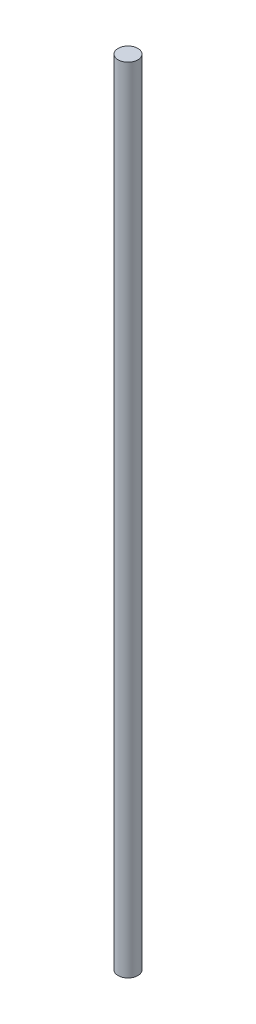
ISO-10303-21;
HEADER;
FILE_DESCRIPTION(('STEP AP214'),'2;1');
FILE_NAME('part.step','',(''),(''),'','','');
FILE_SCHEMA(('AUTOMOTIVE_DESIGN { 1 0 10303 214 1 1 1 1 }'));
ENDSEC;
DATA;
#1=APPLICATION_CONTEXT('core data for automotive mechanical design processes');
#2=APPLICATION_PROTOCOL_DEFINITION('international standard','automotive_design',2000,#1);
#3=PRODUCT_CONTEXT('',#1,'mechanical');
#4=PRODUCT('Part','Part','',(#3));
#5=PRODUCT_RELATED_PRODUCT_CATEGORY('part','',(#4));
#6=PRODUCT_DEFINITION_FORMATION('','',#4);
#7=PRODUCT_DEFINITION_CONTEXT('part definition',#1,'design');
#8=PRODUCT_DEFINITION('design','',#6,#7);
#9=PRODUCT_DEFINITION_SHAPE('','',#8);
#10=(LENGTH_UNIT() NAMED_UNIT(*) SI_UNIT(.MILLI.,.METRE.));
#11=(NAMED_UNIT(*) PLANE_ANGLE_UNIT() SI_UNIT($,.RADIAN.));
#12=(NAMED_UNIT(*) SI_UNIT($,.STERADIAN.) SOLID_ANGLE_UNIT());
#13=UNCERTAINTY_MEASURE_WITH_UNIT(LENGTH_MEASURE(1.E-05),#10,'distance_accuracy_value','');
#14=(GEOMETRIC_REPRESENTATION_CONTEXT(3) GLOBAL_UNCERTAINTY_ASSIGNED_CONTEXT((#13)) GLOBAL_UNIT_ASSIGNED_CONTEXT((#10,
#11,#12)) REPRESENTATION_CONTEXT('',''));
#15=CARTESIAN_POINT('',(0.,0.,0.));
#16=DIRECTION('',(0.,0.,1.));
#17=DIRECTION('',(1.,0.,0.));
#18=AXIS2_PLACEMENT_3D('',#15,#16,#17);
#19=CARTESIAN_POINT('',(0.,-250.,0.));
#20=DIRECTION('',(0.,1.,0.));
#21=DIRECTION('',(0.,0.,1.));
#22=AXIS2_PLACEMENT_3D('',#19,#20,#21);
#23=CYLINDRICAL_SURFACE('',#22,6.25);
#24=CARTESIAN_POINT('',(0.,-250.,0.));
#25=DIRECTION('',(0.,1.,0.));
#26=DIRECTION('',(0.,0.,1.));
#27=AXIS2_PLACEMENT_3D('',#24,#25,#26);
#28=CIRCLE('',#27,6.25);
#29=CARTESIAN_POINT('',(0.,-250.,6.25));
#30=VERTEX_POINT('',#29);
#31=EDGE_CURVE('E10',#30,#30,#28,.T.);
#32=ORIENTED_EDGE('',*,*,#31,.T.);
#33=EDGE_LOOP('',(#32));
#34=FACE_BOUND('',#33,.T.);
#35=CARTESIAN_POINT('',(0.,250.,0.));
#36=DIRECTION('',(0.,1.,0.));
#37=DIRECTION('',(0.,0.,1.));
#38=AXIS2_PLACEMENT_3D('',#35,#36,#37);
#39=CIRCLE('',#38,6.25);
#40=CARTESIAN_POINT('',(0.,250.,6.25));
#41=VERTEX_POINT('',#40);
#42=EDGE_CURVE('E36',#41,#41,#39,.T.);
#43=ORIENTED_EDGE('',*,*,#42,.F.);
#44=EDGE_LOOP('',(#43));
#45=FACE_BOUND('',#44,.T.);
#46=ADVANCED_FACE('F30',(#34,#45),#23,.T.);
#47=CARTESIAN_POINT('',(0.,-250.,0.));
#48=DIRECTION('',(0.,1.,0.));
#49=DIRECTION('',(0.,0.,1.));
#50=AXIS2_PLACEMENT_3D('',#47,#48,#49);
#51=PLANE('',#50);
#52=ORIENTED_EDGE('',*,*,#31,.F.);
#53=EDGE_LOOP('',(#52));
#54=FACE_BOUND('',#53,.T.);
#55=ADVANCED_FACE('F45',(#54),#51,.F.);
#56=CARTESIAN_POINT('',(0.,250.,0.));
#57=DIRECTION('',(0.,1.,0.));
#58=DIRECTION('',(0.,0.,1.));
#59=AXIS2_PLACEMENT_3D('',#56,#57,#58);
#60=PLANE('',#59);
#61=ORIENTED_EDGE('',*,*,#42,.T.);
#62=EDGE_LOOP('',(#61));
#63=FACE_BOUND('',#62,.T.);
#64=ADVANCED_FACE('F42',(#63),#60,.T.);
#65=CLOSED_SHELL('',(#46,#55,#64));
#66=MANIFOLD_SOLID_BREP('B2',#65);
#67=ADVANCED_BREP_SHAPE_REPRESENTATION('',(#18,#66),#14);
#68=SHAPE_DEFINITION_REPRESENTATION(#9,#67);
ENDSEC;
END-ISO-10303-21;
